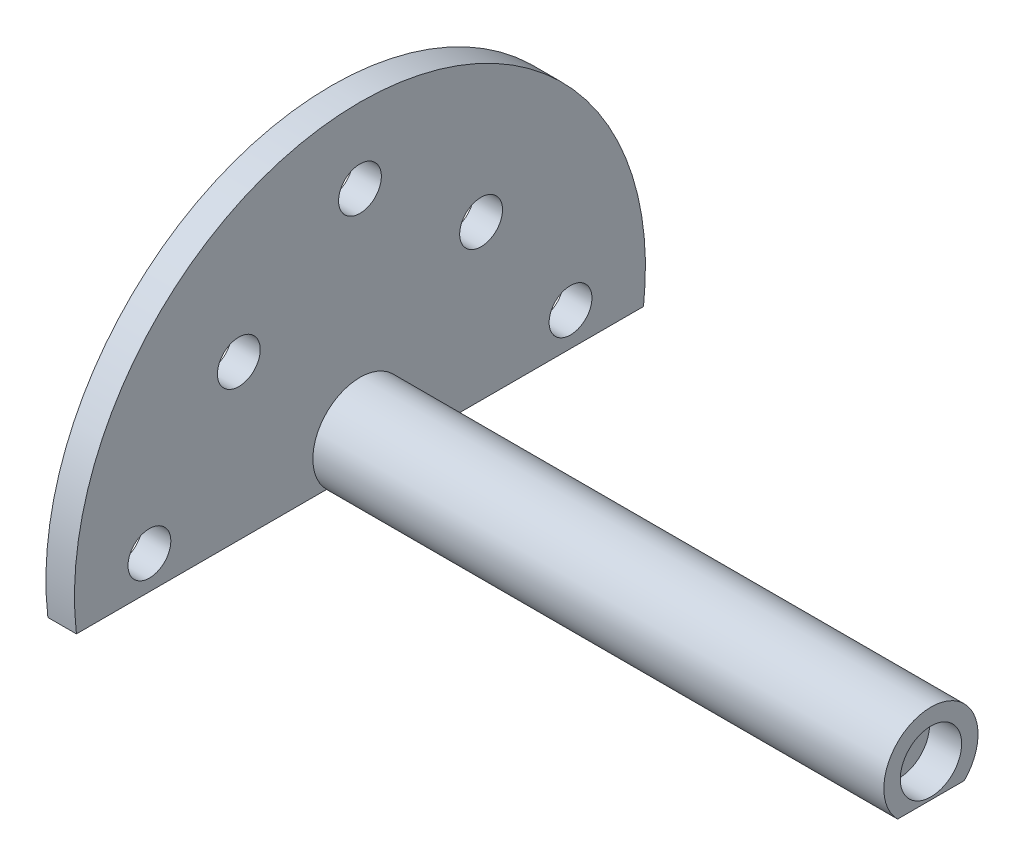
ISO-10303-21;
HEADER;
FILE_DESCRIPTION(('STEP AP214'),'2;1');
FILE_NAME('part.step','',(''),(''),'','','');
FILE_SCHEMA(('AUTOMOTIVE_DESIGN { 1 0 10303 214 1 1 1 1 }'));
ENDSEC;
DATA;
#1=APPLICATION_CONTEXT('core data for automotive mechanical design processes');
#2=APPLICATION_PROTOCOL_DEFINITION('international standard','automotive_design',2000,#1);
#3=PRODUCT_CONTEXT('',#1,'mechanical');
#4=PRODUCT('Part','Part','',(#3));
#5=PRODUCT_RELATED_PRODUCT_CATEGORY('part','',(#4));
#6=PRODUCT_DEFINITION_FORMATION('','',#4);
#7=PRODUCT_DEFINITION_CONTEXT('part definition',#1,'design');
#8=PRODUCT_DEFINITION('design','',#6,#7);
#9=PRODUCT_DEFINITION_SHAPE('','',#8);
#10=(LENGTH_UNIT() NAMED_UNIT(*) SI_UNIT(.MILLI.,.METRE.));
#11=(NAMED_UNIT(*) PLANE_ANGLE_UNIT() SI_UNIT($,.RADIAN.));
#12=(NAMED_UNIT(*) SI_UNIT($,.STERADIAN.) SOLID_ANGLE_UNIT());
#13=UNCERTAINTY_MEASURE_WITH_UNIT(LENGTH_MEASURE(1.E-05),#10,'distance_accuracy_value','');
#14=(GEOMETRIC_REPRESENTATION_CONTEXT(3) GLOBAL_UNCERTAINTY_ASSIGNED_CONTEXT((#13)) GLOBAL_UNIT_ASSIGNED_CONTEXT((#10,
#11,#12)) REPRESENTATION_CONTEXT('',''));
#15=CARTESIAN_POINT('',(0.,0.,0.));
#16=DIRECTION('',(0.,0.,1.));
#17=DIRECTION('',(1.,0.,0.));
#18=AXIS2_PLACEMENT_3D('',#15,#16,#17);
#19=CARTESIAN_POINT('',(2.,-2.33345237791561,0.));
#20=DIRECTION('',(0.,1.,0.));
#21=DIRECTION('',(0.,0.,1.));
#22=AXIS2_PLACEMENT_3D('',#19,#20,#21);
#23=PLANE('',#22);
#24=DIRECTION('',(0.,0.,-1.));
#25=VECTOR('',#24,1.);
#26=CARTESIAN_POINT('',(0.,-2.33345237791561,0.));
#27=LINE('',#26,#25);
#28=CARTESIAN_POINT('',(0.,-2.33345237791561,19.863408569528));
#29=VERTEX_POINT('',#28);
#30=CARTESIAN_POINT('',(0.,-2.33345237791561,-19.863408569528));
#31=VERTEX_POINT('',#30);
#32=EDGE_CURVE('E87',#29,#31,#27,.T.);
#33=ORIENTED_EDGE('',*,*,#32,.T.);
#34=DIRECTION('',(-1.,0.,0.));
#35=VECTOR('',#34,1.);
#36=CARTESIAN_POINT('',(2.,-2.33345237791561,-19.863408569528));
#37=LINE('',#36,#35);
#38=CARTESIAN_POINT('',(2.,-2.33345237791561,-19.863408569528));
#39=VERTEX_POINT('',#38);
#40=EDGE_CURVE('E11',#39,#31,#37,.T.);
#41=ORIENTED_EDGE('',*,*,#40,.F.);
#42=DIRECTION('',(0.,0.,-1.));
#43=VECTOR('',#42,1.);
#44=CARTESIAN_POINT('',(2.,-2.33345237791561,0.));
#45=LINE('',#44,#43);
#46=CARTESIAN_POINT('',(2.,-2.33345237791561,-2.33345237791561));
#47=VERTEX_POINT('',#46);
#48=EDGE_CURVE('E124',#47,#39,#45,.T.);
#49=ORIENTED_EDGE('',*,*,#48,.F.);
#50=DIRECTION('',(-1.,0.,0.));
#51=VECTOR('',#50,1.);
#52=CARTESIAN_POINT('',(42.,-2.33345237791561,-2.33345237791561));
#53=LINE('',#52,#51);
#54=CARTESIAN_POINT('',(42.,-2.33345237791561,-2.33345237791561));
#55=VERTEX_POINT('',#54);
#56=EDGE_CURVE('E102',#55,#47,#53,.T.);
#57=ORIENTED_EDGE('',*,*,#56,.F.);
#58=DIRECTION('',(0.,0.,1.));
#59=VECTOR('',#58,1.);
#60=CARTESIAN_POINT('',(42.,-2.33345237791561,0.));
#61=LINE('',#60,#59);
#62=CARTESIAN_POINT('',(42.,-2.33345237791561,2.3334523779156));
#63=VERTEX_POINT('',#62);
#64=EDGE_CURVE('E351',#55,#63,#61,.T.);
#65=ORIENTED_EDGE('',*,*,#64,.T.);
#66=DIRECTION('',(-1.,0.,0.));
#67=VECTOR('',#66,1.);
#68=CARTESIAN_POINT('',(42.,-2.33345237791561,2.3334523779156));
#69=LINE('',#68,#67);
#70=CARTESIAN_POINT('',(2.,-2.33345237791561,2.3334523779156));
#71=VERTEX_POINT('',#70);
#72=EDGE_CURVE('E97',#63,#71,#69,.T.);
#73=ORIENTED_EDGE('',*,*,#72,.T.);
#74=CARTESIAN_POINT('',(2.,-2.33345237791561,19.863408569528));
#75=VERTEX_POINT('',#74);
#76=EDGE_CURVE('E91',#75,#71,#45,.T.);
#77=ORIENTED_EDGE('',*,*,#76,.F.);
#78=DIRECTION('',(-1.,0.,0.));
#79=VECTOR('',#78,1.);
#80=CARTESIAN_POINT('',(2.,-2.33345237791561,19.863408569528));
#81=LINE('',#80,#79);
#82=EDGE_CURVE('E53',#75,#29,#81,.T.);
#83=ORIENTED_EDGE('',*,*,#82,.T.);
#84=EDGE_LOOP('',(#33,#41,#49,#57,#65,#73,#77,#83));
#85=FACE_BOUND('',#84,.T.);
#86=ADVANCED_FACE('F45',(#85),#23,.F.);
#87=CARTESIAN_POINT('',(2.,0.,-14.75));
#88=DIRECTION('',(-1.,0.,0.));
#89=DIRECTION('',(0.,0.,1.));
#90=AXIS2_PLACEMENT_3D('',#87,#88,#89);
#91=CYLINDRICAL_SURFACE('',#90,1.5);
#92=CARTESIAN_POINT('',(2.,0.,-14.75));
#93=DIRECTION('',(1.,0.,0.));
#94=DIRECTION('',(0.,0.,-1.));
#95=AXIS2_PLACEMENT_3D('',#92,#93,#94);
#96=CIRCLE('',#95,1.5);
#97=CARTESIAN_POINT('',(2.,0.,-16.25));
#98=VERTEX_POINT('',#97);
#99=EDGE_CURVE('E146',#98,#98,#96,.T.);
#100=ORIENTED_EDGE('',*,*,#99,.T.);
#101=EDGE_LOOP('',(#100));
#102=FACE_BOUND('',#101,.T.);
#103=CARTESIAN_POINT('',(0.,0.,-14.75));
#104=DIRECTION('',(1.,0.,0.));
#105=DIRECTION('',(0.,0.,-1.));
#106=AXIS2_PLACEMENT_3D('',#103,#104,#105);
#107=CIRCLE('',#106,1.5);
#108=CARTESIAN_POINT('',(0.,0.,-16.25));
#109=VERTEX_POINT('',#108);
#110=EDGE_CURVE('E118',#109,#109,#107,.T.);
#111=ORIENTED_EDGE('',*,*,#110,.F.);
#112=EDGE_LOOP('',(#111));
#113=FACE_BOUND('',#112,.T.);
#114=ADVANCED_FACE('F170',(#102,#113),#91,.F.);
#115=CARTESIAN_POINT('',(2.,0.,14.75));
#116=DIRECTION('',(-1.,0.,0.));
#117=DIRECTION('',(0.,0.,1.));
#118=AXIS2_PLACEMENT_3D('',#115,#116,#117);
#119=CYLINDRICAL_SURFACE('',#118,1.5);
#120=CARTESIAN_POINT('',(2.,0.,14.75));
#121=DIRECTION('',(1.,0.,0.));
#122=DIRECTION('',(0.,0.,-1.));
#123=AXIS2_PLACEMENT_3D('',#120,#121,#122);
#124=CIRCLE('',#123,1.5);
#125=CARTESIAN_POINT('',(2.,0.,13.25));
#126=VERTEX_POINT('',#125);
#127=EDGE_CURVE('E143',#126,#126,#124,.T.);
#128=ORIENTED_EDGE('',*,*,#127,.T.);
#129=EDGE_LOOP('',(#128));
#130=FACE_BOUND('',#129,.T.);
#131=CARTESIAN_POINT('',(0.,0.,14.75));
#132=DIRECTION('',(1.,0.,0.));
#133=DIRECTION('',(0.,0.,-1.));
#134=AXIS2_PLACEMENT_3D('',#131,#132,#133);
#135=CIRCLE('',#134,1.5);
#136=CARTESIAN_POINT('',(0.,0.,13.25));
#137=VERTEX_POINT('',#136);
#138=EDGE_CURVE('E114',#137,#137,#135,.T.);
#139=ORIENTED_EDGE('',*,*,#138,.F.);
#140=EDGE_LOOP('',(#139));
#141=FACE_BOUND('',#140,.T.);
#142=ADVANCED_FACE('F173',(#130,#141),#119,.F.);
#143=CARTESIAN_POINT('',(2.,8.48528137423857,8.48528137423857));
#144=DIRECTION('',(-1.,0.,0.));
#145=DIRECTION('',(0.,0.,1.));
#146=AXIS2_PLACEMENT_3D('',#143,#144,#145);
#147=CYLINDRICAL_SURFACE('',#146,1.5);
#148=CARTESIAN_POINT('',(2.,8.48528137423857,8.48528137423857));
#149=DIRECTION('',(1.,0.,0.));
#150=DIRECTION('',(0.,0.,-1.));
#151=AXIS2_PLACEMENT_3D('',#148,#149,#150);
#152=CIRCLE('',#151,1.5);
#153=CARTESIAN_POINT('',(2.,8.48528137423857,6.98528137423857));
#154=VERTEX_POINT('',#153);
#155=EDGE_CURVE('E139',#154,#154,#152,.T.);
#156=ORIENTED_EDGE('',*,*,#155,.T.);
#157=EDGE_LOOP('',(#156));
#158=FACE_BOUND('',#157,.T.);
#159=CARTESIAN_POINT('',(0.,8.48528137423857,8.48528137423857));
#160=DIRECTION('',(1.,0.,0.));
#161=DIRECTION('',(0.,0.,-1.));
#162=AXIS2_PLACEMENT_3D('',#159,#160,#161);
#163=CIRCLE('',#162,1.5);
#164=CARTESIAN_POINT('',(0.,8.48528137423857,6.98528137423857));
#165=VERTEX_POINT('',#164);
#166=EDGE_CURVE('E110',#165,#165,#163,.T.);
#167=ORIENTED_EDGE('',*,*,#166,.F.);
#168=EDGE_LOOP('',(#167));
#169=FACE_BOUND('',#168,.T.);
#170=ADVANCED_FACE('F177',(#158,#169),#147,.F.);
#171=CARTESIAN_POINT('',(2.,8.48528137423854,-8.4852813742386));
#172=DIRECTION('',(-1.,0.,0.));
#173=DIRECTION('',(0.,0.,1.));
#174=AXIS2_PLACEMENT_3D('',#171,#172,#173);
#175=CYLINDRICAL_SURFACE('',#174,1.5);
#176=CARTESIAN_POINT('',(2.,8.48528137423854,-8.4852813742386));
#177=DIRECTION('',(1.,0.,0.));
#178=DIRECTION('',(0.,0.,-1.));
#179=AXIS2_PLACEMENT_3D('',#176,#177,#178);
#180=CIRCLE('',#179,1.5);
#181=CARTESIAN_POINT('',(2.,8.48528137423854,-9.9852813742386));
#182=VERTEX_POINT('',#181);
#183=EDGE_CURVE('E135',#182,#182,#180,.T.);
#184=ORIENTED_EDGE('',*,*,#183,.T.);
#185=EDGE_LOOP('',(#184));
#186=FACE_BOUND('',#185,.T.);
#187=CARTESIAN_POINT('',(0.,8.48528137423854,-8.4852813742386));
#188=DIRECTION('',(1.,0.,0.));
#189=DIRECTION('',(0.,0.,-1.));
#190=AXIS2_PLACEMENT_3D('',#187,#188,#189);
#191=CIRCLE('',#190,1.5);
#192=CARTESIAN_POINT('',(0.,8.48528137423854,-9.9852813742386));
#193=VERTEX_POINT('',#192);
#194=EDGE_CURVE('E86',#193,#193,#191,.T.);
#195=ORIENTED_EDGE('',*,*,#194,.F.);
#196=EDGE_LOOP('',(#195));
#197=FACE_BOUND('',#196,.T.);
#198=ADVANCED_FACE('F184',(#186,#197),#175,.F.);
#199=CARTESIAN_POINT('',(2.,0.,0.));
#200=DIRECTION('',(-1.,0.,0.));
#201=DIRECTION('',(0.,0.,1.));
#202=AXIS2_PLACEMENT_3D('',#199,#200,#201);
#203=CYLINDRICAL_SURFACE('',#202,20.);
#204=CARTESIAN_POINT('',(0.,0.,0.));
#205=DIRECTION('',(1.,0.,0.));
#206=DIRECTION('',(0.,0.,-1.));
#207=AXIS2_PLACEMENT_3D('',#204,#205,#206);
#208=CIRCLE('',#207,20.);
#209=EDGE_CURVE('E77',#31,#29,#208,.T.);
#210=ORIENTED_EDGE('',*,*,#209,.T.);
#211=ORIENTED_EDGE('',*,*,#82,.F.);
#212=CARTESIAN_POINT('',(2.,0.,0.));
#213=DIRECTION('',(1.,0.,0.));
#214=DIRECTION('',(0.,0.,-1.));
#215=AXIS2_PLACEMENT_3D('',#212,#213,#214);
#216=CIRCLE('',#215,20.);
#217=EDGE_CURVE('E66',#39,#75,#216,.T.);
#218=ORIENTED_EDGE('',*,*,#217,.F.);
#219=ORIENTED_EDGE('',*,*,#40,.T.);
#220=EDGE_LOOP('',(#210,#211,#218,#219));
#221=FACE_BOUND('',#220,.T.);
#222=ADVANCED_FACE('F79',(#221),#203,.T.);
#223=CARTESIAN_POINT('',(2.,14.75,0.));
#224=DIRECTION('',(-1.,0.,0.));
#225=DIRECTION('',(0.,0.,1.));
#226=AXIS2_PLACEMENT_3D('',#223,#224,#225);
#227=CYLINDRICAL_SURFACE('',#226,1.5);
#228=CARTESIAN_POINT('',(2.,14.75,0.));
#229=DIRECTION('',(1.,0.,0.));
#230=DIRECTION('',(0.,0.,-1.));
#231=AXIS2_PLACEMENT_3D('',#228,#229,#230);
#232=CIRCLE('',#231,1.5);
#233=CARTESIAN_POINT('',(2.,14.75,-1.5));
#234=VERTEX_POINT('',#233);
#235=EDGE_CURVE('E93',#234,#234,#232,.T.);
#236=ORIENTED_EDGE('',*,*,#235,.T.);
#237=EDGE_LOOP('',(#236));
#238=FACE_BOUND('',#237,.T.);
#239=CARTESIAN_POINT('',(0.,14.75,0.));
#240=DIRECTION('',(1.,0.,0.));
#241=DIRECTION('',(0.,0.,-1.));
#242=AXIS2_PLACEMENT_3D('',#239,#240,#241);
#243=CIRCLE('',#242,1.5);
#244=CARTESIAN_POINT('',(0.,14.75,-1.5));
#245=VERTEX_POINT('',#244);
#246=EDGE_CURVE('E121',#245,#245,#243,.T.);
#247=ORIENTED_EDGE('',*,*,#246,.F.);
#248=EDGE_LOOP('',(#247));
#249=FACE_BOUND('',#248,.T.);
#250=ADVANCED_FACE('F155',(#238,#249),#227,.F.);
#251=CARTESIAN_POINT('',(2.,0.,0.));
#252=DIRECTION('',(1.,0.,0.));
#253=DIRECTION('',(0.,0.,-1.));
#254=AXIS2_PLACEMENT_3D('',#251,#252,#253);
#255=PLANE('',#254);
#256=CARTESIAN_POINT('',(2.,0.,0.));
#257=DIRECTION('',(1.,0.,0.));
#258=DIRECTION('',(0.,0.,-1.));
#259=AXIS2_PLACEMENT_3D('',#256,#257,#258);
#260=CIRCLE('',#259,3.3);
#261=EDGE_CURVE('E60',#47,#71,#260,.T.);
#262=ORIENTED_EDGE('',*,*,#261,.F.);
#263=ORIENTED_EDGE('',*,*,#48,.T.);
#264=ORIENTED_EDGE('',*,*,#217,.T.);
#265=ORIENTED_EDGE('',*,*,#76,.T.);
#266=EDGE_LOOP('',(#262,#263,#264,#265));
#267=FACE_BOUND('',#266,.T.);
#268=ORIENTED_EDGE('',*,*,#183,.F.);
#269=EDGE_LOOP('',(#268));
#270=FACE_BOUND('',#269,.T.);
#271=ORIENTED_EDGE('',*,*,#155,.F.);
#272=EDGE_LOOP('',(#271));
#273=FACE_BOUND('',#272,.T.);
#274=ORIENTED_EDGE('',*,*,#127,.F.);
#275=EDGE_LOOP('',(#274));
#276=FACE_BOUND('',#275,.T.);
#277=ORIENTED_EDGE('',*,*,#99,.F.);
#278=EDGE_LOOP('',(#277));
#279=FACE_BOUND('',#278,.T.);
#280=ORIENTED_EDGE('',*,*,#235,.F.);
#281=EDGE_LOOP('',(#280));
#282=FACE_BOUND('',#281,.T.);
#283=ADVANCED_FACE('F158',(#267,#270,#273,#276,#279,#282),#255,.T.);
#284=CARTESIAN_POINT('',(0.,0.,0.));
#285=DIRECTION('',(1.,0.,0.));
#286=DIRECTION('',(0.,0.,-1.));
#287=AXIS2_PLACEMENT_3D('',#284,#285,#286);
#288=PLANE('',#287);
#289=ORIENTED_EDGE('',*,*,#32,.F.);
#290=ORIENTED_EDGE('',*,*,#209,.F.);
#291=EDGE_LOOP('',(#289,#290));
#292=FACE_BOUND('',#291,.T.);
#293=ORIENTED_EDGE('',*,*,#194,.T.);
#294=EDGE_LOOP('',(#293));
#295=FACE_BOUND('',#294,.T.);
#296=ORIENTED_EDGE('',*,*,#166,.T.);
#297=EDGE_LOOP('',(#296));
#298=FACE_BOUND('',#297,.T.);
#299=ORIENTED_EDGE('',*,*,#138,.T.);
#300=EDGE_LOOP('',(#299));
#301=FACE_BOUND('',#300,.T.);
#302=ORIENTED_EDGE('',*,*,#110,.T.);
#303=EDGE_LOOP('',(#302));
#304=FACE_BOUND('',#303,.T.);
#305=ORIENTED_EDGE('',*,*,#246,.T.);
#306=EDGE_LOOP('',(#305));
#307=FACE_BOUND('',#306,.T.);
#308=ADVANCED_FACE('F94',(#292,#295,#298,#301,#304,#307),#288,.F.);
#309=CARTESIAN_POINT('',(42.,0.,0.));
#310=DIRECTION('',(-1.,0.,0.));
#311=DIRECTION('',(0.,0.,1.));
#312=AXIS2_PLACEMENT_3D('',#309,#310,#311);
#313=CYLINDRICAL_SURFACE('',#312,3.3);
#314=ORIENTED_EDGE('',*,*,#261,.T.);
#315=ORIENTED_EDGE('',*,*,#72,.F.);
#316=CARTESIAN_POINT('',(42.,0.,0.));
#317=DIRECTION('',(1.,0.,0.));
#318=DIRECTION('',(0.,0.,-1.));
#319=AXIS2_PLACEMENT_3D('',#316,#317,#318);
#320=CIRCLE('',#319,3.3);
#321=EDGE_CURVE('E343',#55,#63,#320,.T.);
#322=ORIENTED_EDGE('',*,*,#321,.F.);
#323=ORIENTED_EDGE('',*,*,#56,.T.);
#324=EDGE_LOOP('',(#314,#315,#322,#323));
#325=FACE_BOUND('',#324,.T.);
#326=ADVANCED_FACE('F164',(#325),#313,.T.);
#327=CARTESIAN_POINT('',(42.,0.,0.));
#328=DIRECTION('',(1.,0.,0.));
#329=DIRECTION('',(0.,0.,-1.));
#330=AXIS2_PLACEMENT_3D('',#327,#328,#329);
#331=PLANE('',#330);
#332=CARTESIAN_POINT('',(42.,0.,0.));
#333=DIRECTION('',(1.,0.,0.));
#334=DIRECTION('',(0.,0.,-1.));
#335=AXIS2_PLACEMENT_3D('',#332,#333,#334);
#336=CIRCLE('',#335,2.15);
#337=CARTESIAN_POINT('',(42.,0.,-2.15));
#338=VERTEX_POINT('',#337);
#339=EDGE_CURVE('E340',#338,#338,#336,.T.);
#340=ORIENTED_EDGE('',*,*,#339,.F.);
#341=EDGE_LOOP('',(#340));
#342=FACE_BOUND('',#341,.T.);
#343=ORIENTED_EDGE('',*,*,#321,.T.);
#344=ORIENTED_EDGE('',*,*,#64,.F.);
#345=EDGE_LOOP('',(#343,#344));
#346=FACE_BOUND('',#345,.T.);
#347=ADVANCED_FACE('F222',(#342,#346),#331,.T.);
#348=CARTESIAN_POINT('',(39.75,0.,0.));
#349=DIRECTION('',(1.,0.,0.));
#350=DIRECTION('',(0.,0.,-1.));
#351=AXIS2_PLACEMENT_3D('',#348,#349,#350);
#352=CYLINDRICAL_SURFACE('',#351,2.15);
#353=CARTESIAN_POINT('',(39.75,0.,0.));
#354=DIRECTION('',(1.,0.,0.));
#355=DIRECTION('',(0.,0.,-1.));
#356=AXIS2_PLACEMENT_3D('',#353,#354,#355);
#357=CIRCLE('',#356,2.15);
#358=CARTESIAN_POINT('',(39.75,0.,-2.15));
#359=VERTEX_POINT('',#358);
#360=EDGE_CURVE('E338',#359,#359,#357,.T.);
#361=ORIENTED_EDGE('',*,*,#360,.F.);
#362=EDGE_LOOP('',(#361));
#363=FACE_BOUND('',#362,.T.);
#364=ORIENTED_EDGE('',*,*,#339,.T.);
#365=EDGE_LOOP('',(#364));
#366=FACE_BOUND('',#365,.T.);
#367=ADVANCED_FACE('F232',(#363,#366),#352,.F.);
#368=CARTESIAN_POINT('',(39.75,0.,0.));
#369=DIRECTION('',(1.,0.,0.));
#370=DIRECTION('',(0.,0.,-1.));
#371=AXIS2_PLACEMENT_3D('',#368,#369,#370);
#372=PLANE('',#371);
#373=ORIENTED_EDGE('',*,*,#360,.T.);
#374=EDGE_LOOP('',(#373));
#375=FACE_BOUND('',#374,.T.);
#376=ADVANCED_FACE('F242',(#375),#372,.T.);
#377=CLOSED_SHELL('',(#86,#114,#142,#170,#198,#222,#250,#283,#308,#326,#347,#367,#376));
#378=MANIFOLD_SOLID_BREP('B2',#377);
#379=ADVANCED_BREP_SHAPE_REPRESENTATION('',(#18,#378),#14);
#380=SHAPE_DEFINITION_REPRESENTATION(#9,#379);
ENDSEC;
END-ISO-10303-21;
